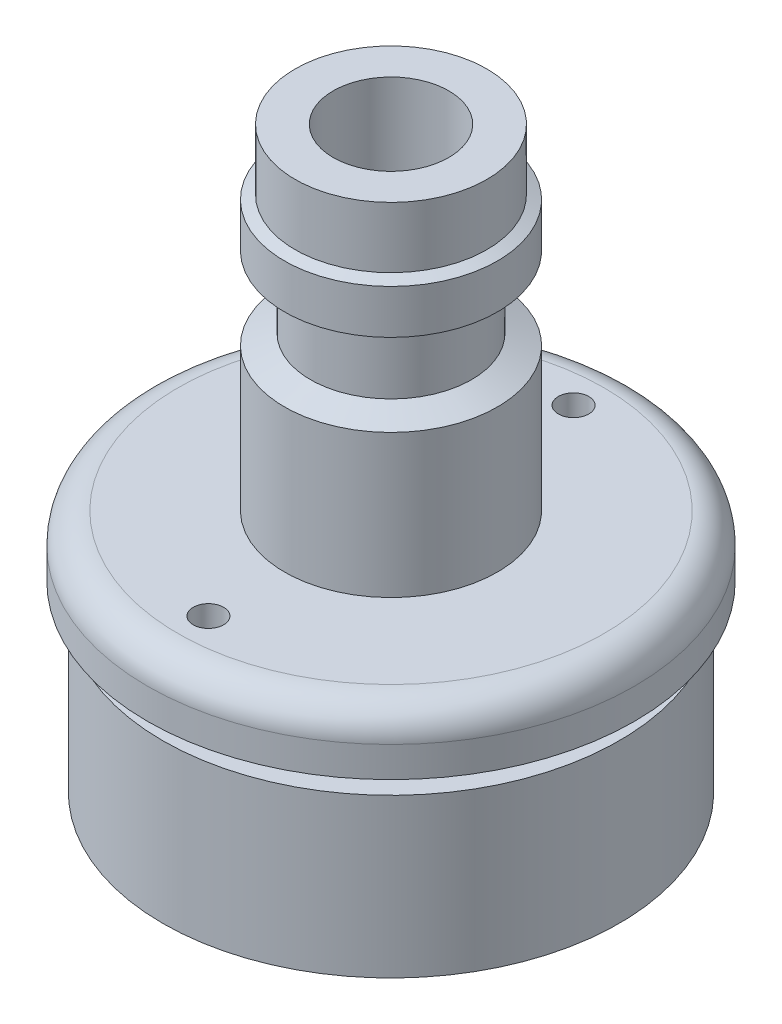
ISO-10303-21;
HEADER;
FILE_DESCRIPTION(('STEP AP214'),'2;1');
FILE_NAME('part.step','',(''),(''),'','','');
FILE_SCHEMA(('AUTOMOTIVE_DESIGN { 1 0 10303 214 1 1 1 1 }'));
ENDSEC;
DATA;
#1=APPLICATION_CONTEXT('core data for automotive mechanical design processes');
#2=APPLICATION_PROTOCOL_DEFINITION('international standard','automotive_design',2000,#1);
#3=PRODUCT_CONTEXT('',#1,'mechanical');
#4=PRODUCT('Part','Part','',(#3));
#5=PRODUCT_RELATED_PRODUCT_CATEGORY('part','',(#4));
#6=PRODUCT_DEFINITION_FORMATION('','',#4);
#7=PRODUCT_DEFINITION_CONTEXT('part definition',#1,'design');
#8=PRODUCT_DEFINITION('design','',#6,#7);
#9=PRODUCT_DEFINITION_SHAPE('','',#8);
#10=(LENGTH_UNIT() NAMED_UNIT(*) SI_UNIT(.MILLI.,.METRE.));
#11=(NAMED_UNIT(*) PLANE_ANGLE_UNIT() SI_UNIT($,.RADIAN.));
#12=(NAMED_UNIT(*) SI_UNIT($,.STERADIAN.) SOLID_ANGLE_UNIT());
#13=UNCERTAINTY_MEASURE_WITH_UNIT(LENGTH_MEASURE(1.E-05),#10,'distance_accuracy_value','');
#14=(GEOMETRIC_REPRESENTATION_CONTEXT(3) GLOBAL_UNCERTAINTY_ASSIGNED_CONTEXT((#13)) GLOBAL_UNIT_ASSIGNED_CONTEXT((#10,
#11,#12)) REPRESENTATION_CONTEXT('',''));
#15=CARTESIAN_POINT('',(0.,0.,0.));
#16=DIRECTION('',(0.,0.,1.));
#17=DIRECTION('',(1.,0.,0.));
#18=AXIS2_PLACEMENT_3D('',#15,#16,#17);
#19=CARTESIAN_POINT('',(8.89,2.54,0.));
#20=DIRECTION('',(0.,1.,0.));
#21=DIRECTION('',(0.,0.,1.));
#22=AXIS2_PLACEMENT_3D('',#19,#20,#21);
#23=PLANE('',#22);
#24=CARTESIAN_POINT('',(0.,2.54,0.));
#25=DIRECTION('',(0.,-1.,0.));
#26=DIRECTION('',(0.,0.,-1.));
#27=AXIS2_PLACEMENT_3D('',#24,#25,#26);
#28=CIRCLE('',#27,8.89);
#29=CARTESIAN_POINT('',(0.,2.54,-8.89));
#30=VERTEX_POINT('',#29);
#31=EDGE_CURVE('E65',#30,#30,#28,.T.);
#32=ORIENTED_EDGE('',*,*,#31,.F.);
#33=EDGE_LOOP('',(#32));
#34=FACE_BOUND('',#33,.T.);
#35=CARTESIAN_POINT('',(0.,2.54,0.));
#36=DIRECTION('',(0.,-1.,0.));
#37=DIRECTION('',(0.,0.,-1.));
#38=AXIS2_PLACEMENT_3D('',#35,#36,#37);
#39=CIRCLE('',#38,4.445);
#40=CARTESIAN_POINT('',(0.,2.54,-4.445));
#41=VERTEX_POINT('',#40);
#42=EDGE_CURVE('E69',#41,#41,#39,.T.);
#43=ORIENTED_EDGE('',*,*,#42,.T.);
#44=EDGE_LOOP('',(#43));
#45=FACE_BOUND('',#44,.T.);
#46=CARTESIAN_POINT('',(0.,2.54,-7.62));
#47=DIRECTION('',(0.,1.,0.));
#48=DIRECTION('',(0.,0.,1.));
#49=AXIS2_PLACEMENT_3D('',#46,#47,#48);
#50=CIRCLE('',#49,0.635);
#51=CARTESIAN_POINT('',(0.,2.54,-6.985));
#52=VERTEX_POINT('',#51);
#53=EDGE_CURVE('E103',#52,#52,#50,.T.);
#54=ORIENTED_EDGE('',*,*,#53,.F.);
#55=EDGE_LOOP('',(#54));
#56=FACE_BOUND('',#55,.T.);
#57=CARTESIAN_POINT('',(0.,2.54,7.62));
#58=DIRECTION('',(0.,-1.,0.));
#59=DIRECTION('',(0.,0.,-1.));
#60=AXIS2_PLACEMENT_3D('',#57,#58,#59);
#61=CIRCLE('',#60,0.635);
#62=CARTESIAN_POINT('',(0.,2.54,6.985));
#63=VERTEX_POINT('',#62);
#64=EDGE_CURVE('E109',#63,#63,#61,.T.);
#65=ORIENTED_EDGE('',*,*,#64,.T.);
#66=EDGE_LOOP('',(#65));
#67=FACE_BOUND('',#66,.T.);
#68=ADVANCED_FACE('F32',(#34,#45,#56,#67),#23,.T.);
#69=CARTESIAN_POINT('',(4.0005,16.51,0.));
#70=DIRECTION('',(0.,1.,0.));
#71=DIRECTION('',(0.,0.,1.));
#72=AXIS2_PLACEMENT_3D('',#69,#70,#71);
#73=PLANE('',#72);
#74=CARTESIAN_POINT('',(0.,16.51,0.));
#75=DIRECTION('',(0.,-1.,0.));
#76=DIRECTION('',(0.,0.,-1.));
#77=AXIS2_PLACEMENT_3D('',#74,#75,#76);
#78=CIRCLE('',#77,4.0005);
#79=CARTESIAN_POINT('',(0.,16.51,-4.0005));
#80=VERTEX_POINT('',#79);
#81=EDGE_CURVE('E90',#80,#80,#78,.T.);
#82=ORIENTED_EDGE('',*,*,#81,.F.);
#83=EDGE_LOOP('',(#82));
#84=FACE_BOUND('',#83,.T.);
#85=CARTESIAN_POINT('',(0.,16.51,0.));
#86=DIRECTION('',(0.,1.,0.));
#87=DIRECTION('',(0.,0.,1.));
#88=AXIS2_PLACEMENT_3D('',#85,#86,#87);
#89=CIRCLE('',#88,2.413);
#90=CARTESIAN_POINT('',(0.,16.51,2.413));
#91=VERTEX_POINT('',#90);
#92=EDGE_CURVE('E97',#91,#91,#89,.T.);
#93=ORIENTED_EDGE('',*,*,#92,.F.);
#94=EDGE_LOOP('',(#93));
#95=FACE_BOUND('',#94,.T.);
#96=ADVANCED_FACE('F127',(#84,#95),#73,.T.);
#97=CARTESIAN_POINT('',(0.,0.,0.));
#98=DIRECTION('',(0.,1.,0.));
#99=DIRECTION('',(0.,0.,1.));
#100=AXIS2_PLACEMENT_3D('',#97,#98,#99);
#101=PLANE('',#100);
#102=CARTESIAN_POINT('',(0.,0.,0.));
#103=DIRECTION('',(0.,1.,0.));
#104=DIRECTION('',(0.,0.,1.));
#105=AXIS2_PLACEMENT_3D('',#102,#103,#104);
#106=CIRCLE('',#105,4.19100000000003);
#107=CARTESIAN_POINT('',(0.,0.,4.19100000000003));
#108=VERTEX_POINT('',#107);
#109=EDGE_CURVE('E39',#108,#108,#106,.T.);
#110=ORIENTED_EDGE('',*,*,#109,.T.);
#111=EDGE_LOOP('',(#110));
#112=FACE_BOUND('',#111,.T.);
#113=CARTESIAN_POINT('',(0.,0.,0.));
#114=DIRECTION('',(0.,1.,0.));
#115=DIRECTION('',(0.,0.,1.));
#116=AXIS2_PLACEMENT_3D('',#113,#114,#115);
#117=CIRCLE('',#116,7.1374);
#118=CARTESIAN_POINT('',(0.,0.,7.1374));
#119=VERTEX_POINT('',#118);
#120=EDGE_CURVE('E94',#119,#119,#117,.T.);
#121=ORIENTED_EDGE('',*,*,#120,.F.);
#122=EDGE_LOOP('',(#121));
#123=FACE_BOUND('',#122,.T.);
#124=ADVANCED_FACE('F133',(#112,#123),#101,.F.);
#125=CARTESIAN_POINT('',(0.,-7.62,0.));
#126=DIRECTION('',(0.,1.,0.));
#127=DIRECTION('',(0.,0.,1.));
#128=AXIS2_PLACEMENT_3D('',#125,#126,#127);
#129=CYLINDRICAL_SURFACE('',#128,9.525);
#130=CARTESIAN_POINT('',(0.,-7.62,0.));
#131=DIRECTION('',(0.,1.,0.));
#132=DIRECTION('',(0.,0.,1.));
#133=AXIS2_PLACEMENT_3D('',#130,#131,#132);
#134=CIRCLE('',#133,9.525);
#135=CARTESIAN_POINT('',(0.,-7.62,9.525));
#136=VERTEX_POINT('',#135);
#137=EDGE_CURVE('E43',#136,#136,#134,.T.);
#138=CARTESIAN_POINT('',(0.,-1.016,0.));
#139=DIRECTION('',(0.,1.,0.));
#140=DIRECTION('',(0.,0.,1.));
#141=AXIS2_PLACEMENT_3D('',#138,#139,#140);
#142=CIRCLE('',#141,9.525);
#143=CARTESIAN_POINT('',(0.,-1.016,9.525));
#144=VERTEX_POINT('',#143);
#145=EDGE_CURVE('E48',#144,#144,#142,.F.);
#146=CARTESIAN_POINT('',(0.,-7.62,9.525));
#147=CARTESIAN_POINT('',(0.,-7.55120833333333,9.525));
#148=CARTESIAN_POINT('',(0.,-7.48241666666667,9.525));
#149=CARTESIAN_POINT('',(0.,-7.34483333333333,9.525));
#150=CARTESIAN_POINT('',(0.,-7.27604166666667,9.525));
#151=CARTESIAN_POINT('',(0.,-7.13845833333333,9.525));
#152=CARTESIAN_POINT('',(0.,-7.06966666666667,9.525));
#153=CARTESIAN_POINT('',(0.,-6.93208333333333,9.525));
#154=CARTESIAN_POINT('',(0.,-6.86329166666667,9.525));
#155=CARTESIAN_POINT('',(0.,-6.72570833333333,9.525));
#156=CARTESIAN_POINT('',(0.,-6.65691666666667,9.525));
#157=CARTESIAN_POINT('',(0.,-6.51933333333333,9.525));
#158=CARTESIAN_POINT('',(0.,-6.45054166666667,9.525));
#159=CARTESIAN_POINT('',(0.,-6.31295833333333,9.525));
#160=CARTESIAN_POINT('',(0.,-6.24416666666667,9.525));
#161=CARTESIAN_POINT('',(0.,-6.10658333333333,9.525));
#162=CARTESIAN_POINT('',(0.,-6.03779166666667,9.525));
#163=CARTESIAN_POINT('',(0.,-5.90020833333333,9.525));
#164=CARTESIAN_POINT('',(0.,-5.83141666666667,9.525));
#165=CARTESIAN_POINT('',(0.,-5.69383333333333,9.525));
#166=CARTESIAN_POINT('',(0.,-5.62504166666667,9.525));
#167=CARTESIAN_POINT('',(0.,-5.48745833333333,9.525));
#168=CARTESIAN_POINT('',(0.,-5.41866666666667,9.525));
#169=CARTESIAN_POINT('',(0.,-5.28108333333333,9.525));
#170=CARTESIAN_POINT('',(0.,-5.21229166666667,9.525));
#171=CARTESIAN_POINT('',(0.,-5.07470833333333,9.525));
#172=CARTESIAN_POINT('',(0.,-5.00591666666667,9.525));
#173=CARTESIAN_POINT('',(0.,-4.86833333333333,9.525));
#174=CARTESIAN_POINT('',(0.,-4.79954166666667,9.525));
#175=CARTESIAN_POINT('',(0.,-4.66195833333333,9.525));
#176=CARTESIAN_POINT('',(0.,-4.59316666666667,9.525));
#177=CARTESIAN_POINT('',(0.,-4.45558333333333,9.525));
#178=CARTESIAN_POINT('',(0.,-4.38679166666667,9.525));
#179=CARTESIAN_POINT('',(0.,-4.24920833333333,9.525));
#180=CARTESIAN_POINT('',(0.,-4.18041666666667,9.525));
#181=CARTESIAN_POINT('',(0.,-4.04283333333333,9.525));
#182=CARTESIAN_POINT('',(0.,-3.97404166666667,9.525));
#183=CARTESIAN_POINT('',(0.,-3.83645833333333,9.525));
#184=CARTESIAN_POINT('',(0.,-3.76766666666667,9.525));
#185=CARTESIAN_POINT('',(0.,-3.63008333333333,9.525));
#186=CARTESIAN_POINT('',(0.,-3.56129166666667,9.525));
#187=CARTESIAN_POINT('',(0.,-3.42370833333333,9.525));
#188=CARTESIAN_POINT('',(0.,-3.35491666666667,9.525));
#189=CARTESIAN_POINT('',(0.,-3.21733333333333,9.525));
#190=CARTESIAN_POINT('',(0.,-3.14854166666667,9.525));
#191=CARTESIAN_POINT('',(0.,-3.01095833333333,9.525));
#192=CARTESIAN_POINT('',(0.,-2.94216666666667,9.525));
#193=CARTESIAN_POINT('',(0.,-2.80458333333333,9.525));
#194=CARTESIAN_POINT('',(0.,-2.73579166666667,9.525));
#195=CARTESIAN_POINT('',(0.,-2.59820833333333,9.525));
#196=CARTESIAN_POINT('',(0.,-2.52941666666667,9.525));
#197=CARTESIAN_POINT('',(0.,-2.39183333333333,9.525));
#198=CARTESIAN_POINT('',(0.,-2.32304166666667,9.525));
#199=CARTESIAN_POINT('',(0.,-2.18545833333333,9.525));
#200=CARTESIAN_POINT('',(0.,-2.11666666666667,9.525));
#201=CARTESIAN_POINT('',(0.,-1.97908333333333,9.525));
#202=CARTESIAN_POINT('',(0.,-1.91029166666667,9.525));
#203=CARTESIAN_POINT('',(0.,-1.77270833333333,9.525));
#204=CARTESIAN_POINT('',(0.,-1.70391666666667,9.525));
#205=CARTESIAN_POINT('',(0.,-1.56633333333333,9.525));
#206=CARTESIAN_POINT('',(0.,-1.49754166666667,9.525));
#207=CARTESIAN_POINT('',(0.,-1.35995833333333,9.525));
#208=CARTESIAN_POINT('',(0.,-1.29116666666667,9.525));
#209=CARTESIAN_POINT('',(0.,-1.15358333333333,9.525));
#210=CARTESIAN_POINT('',(0.,-1.08479166666667,9.525));
#211=CARTESIAN_POINT('',(0.,-1.016,9.525));
#212=B_SPLINE_CURVE_WITH_KNOTS('',3,(#146,#147,#148,#149,#150,#151,#152,#153,#154,#155,#156,
#157,#158,#159,#160,#161,#162,#163,#164,#165,#166,#167,#168,#169,#170,#171,#172,#173,#174,#175,
#176,#177,#178,#179,#180,#181,#182,#183,#184,#185,#186,#187,#188,#189,#190,#191,#192,#193,#194,
#195,#196,#197,#198,#199,#200,#201,#202,#203,#204,#205,#206,#207,#208,#209,#210,#211),
.UNSPECIFIED.,.F.,.F.,(4,2,2,2,2,2,2,2,2,2,2,2,2,2,2,2,2,2,2,2,2,2,2,2,2,2,2,2,2,2,2,2,4),(0.,
0.206374999999999,0.412749999999999,0.619124999999999,0.825499999999999,1.031875,1.23825,
1.444625,1.651,1.857375,2.06375,2.270125,2.4765,2.682875,2.88925,3.095625,3.302,3.508375,
3.71475,3.921125,4.1275,4.333875,4.54025,4.746625,4.953,5.159375,5.36575,5.572125,5.7785,
5.984875,6.19125,6.397625,6.604),.UNSPECIFIED.);
#213=EDGE_CURVE('BSEAM164',#136,#144,#212,.T.);
#214=ORIENTED_EDGE('',*,*,#137,.T.);
#215=ORIENTED_EDGE('',*,*,#145,.T.);
#216=ORIENTED_EDGE('',*,*,#213,.T.);
#217=ORIENTED_EDGE('',*,*,#213,.F.);
#218=EDGE_LOOP('',(#214,#216,#215,#217));
#219=FACE_BOUND('',#218,.T.);
#220=ADVANCED_FACE('F164',(#219),#129,.T.);
#221=CARTESIAN_POINT('',(0.,-7.62,0.));
#222=DIRECTION('',(0.,1.,0.));
#223=DIRECTION('',(0.,0.,1.));
#224=AXIS2_PLACEMENT_3D('',#221,#222,#223);
#225=PLANE('',#224);
#226=CARTESIAN_POINT('',(0.,-7.62,0.));
#227=DIRECTION('',(0.,1.,0.));
#228=DIRECTION('',(0.,0.,1.));
#229=AXIS2_PLACEMENT_3D('',#226,#227,#228);
#230=CIRCLE('',#229,7.1374);
#231=CARTESIAN_POINT('',(0.,-7.62,7.1374));
#232=VERTEX_POINT('',#231);
#233=EDGE_CURVE('E93',#232,#232,#230,.T.);
#234=ORIENTED_EDGE('',*,*,#233,.T.);
#235=EDGE_LOOP('',(#234));
#236=FACE_BOUND('',#235,.T.);
#237=ORIENTED_EDGE('',*,*,#137,.F.);
#238=EDGE_LOOP('',(#237));
#239=FACE_BOUND('',#238,.T.);
#240=ADVANCED_FACE('F161',(#236,#239),#225,.F.);
#241=CARTESIAN_POINT('',(0.,-1.016,0.));
#242=DIRECTION('',(0.,1.,0.));
#243=DIRECTION('',(0.,0.,1.));
#244=AXIS2_PLACEMENT_3D('',#241,#242,#243);
#245=PLANE('',#244);
#246=ORIENTED_EDGE('',*,*,#145,.F.);
#247=EDGE_LOOP('',(#246));
#248=FACE_BOUND('',#247,.T.);
#249=CARTESIAN_POINT('',(0.,-1.016,0.));
#250=DIRECTION('',(0.,1.,0.));
#251=DIRECTION('',(0.,0.,1.));
#252=AXIS2_PLACEMENT_3D('',#249,#250,#251);
#253=CIRCLE('',#252,8.509);
#254=CARTESIAN_POINT('',(0.,-1.016,8.509));
#255=VERTEX_POINT('',#254);
#256=EDGE_CURVE('E52',#255,#255,#253,.T.);
#257=ORIENTED_EDGE('',*,*,#256,.F.);
#258=EDGE_LOOP('',(#257));
#259=FACE_BOUND('',#258,.T.);
#260=ADVANCED_FACE('F157',(#248,#259),#245,.T.);
#261=CARTESIAN_POINT('',(0.,-1.016,0.));
#262=DIRECTION('',(0.,1.,0.));
#263=DIRECTION('',(0.,0.,1.));
#264=AXIS2_PLACEMENT_3D('',#261,#262,#263);
#265=CYLINDRICAL_SURFACE('',#264,8.509);
#266=ORIENTED_EDGE('',*,*,#256,.T.);
#267=EDGE_LOOP('',(#266));
#268=FACE_BOUND('',#267,.T.);
#269=CARTESIAN_POINT('',(0.,0.,0.));
#270=DIRECTION('',(0.,1.,0.));
#271=DIRECTION('',(0.,0.,1.));
#272=AXIS2_PLACEMENT_3D('',#269,#270,#271);
#273=CIRCLE('',#272,8.509);
#274=CARTESIAN_POINT('',(0.,0.,8.509));
#275=VERTEX_POINT('',#274);
#276=EDGE_CURVE('E54',#275,#275,#273,.T.);
#277=ORIENTED_EDGE('',*,*,#276,.F.);
#278=EDGE_LOOP('',(#277));
#279=FACE_BOUND('',#278,.T.);
#280=ADVANCED_FACE('F153',(#268,#279),#265,.T.);
#281=CARTESIAN_POINT('',(0.,0.,0.));
#282=DIRECTION('',(0.,-1.,0.));
#283=DIRECTION('',(0.,0.,-1.));
#284=AXIS2_PLACEMENT_3D('',#281,#282,#283);
#285=PLANE('',#284);
#286=ORIENTED_EDGE('',*,*,#276,.T.);
#287=EDGE_LOOP('',(#286));
#288=FACE_BOUND('',#287,.T.);
#289=CARTESIAN_POINT('',(0.,0.,0.));
#290=DIRECTION('',(0.,-1.,0.));
#291=DIRECTION('',(0.,0.,-1.));
#292=AXIS2_PLACEMENT_3D('',#289,#290,#291);
#293=CIRCLE('',#292,10.16);
#294=CARTESIAN_POINT('',(0.,0.,-10.16));
#295=VERTEX_POINT('',#294);
#296=EDGE_CURVE('E57',#295,#295,#293,.T.);
#297=ORIENTED_EDGE('',*,*,#296,.T.);
#298=EDGE_LOOP('',(#297));
#299=FACE_BOUND('',#298,.T.);
#300=ADVANCED_FACE('F149',(#288,#299),#285,.T.);
#301=CARTESIAN_POINT('',(0.,0.,0.));
#302=DIRECTION('',(0.,-1.,0.));
#303=DIRECTION('',(0.,0.,-1.));
#304=AXIS2_PLACEMENT_3D('',#301,#302,#303);
#305=CYLINDRICAL_SURFACE('',#304,10.16);
#306=CARTESIAN_POINT('',(0.,1.27,0.));
#307=DIRECTION('',(0.,-1.,0.));
#308=DIRECTION('',(0.,0.,-1.));
#309=AXIS2_PLACEMENT_3D('',#306,#307,#308);
#310=CIRCLE('',#309,10.16);
#311=CARTESIAN_POINT('',(0.,1.27,-10.16));
#312=VERTEX_POINT('',#311);
#313=EDGE_CURVE('E62',#312,#312,#310,.T.);
#314=ORIENTED_EDGE('',*,*,#313,.T.);
#315=EDGE_LOOP('',(#314));
#316=FACE_BOUND('',#315,.T.);
#317=ORIENTED_EDGE('',*,*,#296,.F.);
#318=EDGE_LOOP('',(#317));
#319=FACE_BOUND('',#318,.T.);
#320=ADVANCED_FACE('F145',(#316,#319),#305,.T.);
#321=CARTESIAN_POINT('',(0.,1.27,0.));
#322=DIRECTION('',(0.,-1.,0.));
#323=DIRECTION('',(0.,0.,-1.));
#324=AXIS2_PLACEMENT_3D('',#321,#322,#323);
#325=TOROIDAL_SURFACE('',#324,8.89,1.27);
#326=ORIENTED_EDGE('',*,*,#31,.T.);
#327=EDGE_LOOP('',(#326));
#328=FACE_BOUND('',#327,.T.);
#329=ORIENTED_EDGE('',*,*,#313,.F.);
#330=EDGE_LOOP('',(#329));
#331=FACE_BOUND('',#330,.T.);
#332=ADVANCED_FACE('F142',(#328,#331),#325,.T.);
#333=CARTESIAN_POINT('',(0.,0.,0.));
#334=DIRECTION('',(0.,-1.,0.));
#335=DIRECTION('',(0.,0.,-1.));
#336=AXIS2_PLACEMENT_3D('',#333,#334,#335);
#337=CYLINDRICAL_SURFACE('',#336,4.445);
#338=CARTESIAN_POINT('',(0.,8.509,0.));
#339=DIRECTION('',(0.,-1.,0.));
#340=DIRECTION('',(0.,0.,-1.));
#341=AXIS2_PLACEMENT_3D('',#338,#339,#340);
#342=CIRCLE('',#341,4.445);
#343=CARTESIAN_POINT('',(0.,8.509,-4.445));
#344=VERTEX_POINT('',#343);
#345=EDGE_CURVE('E72',#344,#344,#342,.T.);
#346=ORIENTED_EDGE('',*,*,#345,.T.);
#347=EDGE_LOOP('',(#346));
#348=FACE_BOUND('',#347,.T.);
#349=ORIENTED_EDGE('',*,*,#42,.F.);
#350=EDGE_LOOP('',(#349));
#351=FACE_BOUND('',#350,.T.);
#352=ADVANCED_FACE('F140',(#348,#351),#337,.T.);
#353=CARTESIAN_POINT('',(0.,8.95614354058175,0.));
#354=DIRECTION('',(0.,-1.,0.));
#355=DIRECTION('',(0.,0.,-1.));
#356=AXIS2_PLACEMENT_3D('',#353,#354,#355);
#357=CONICAL_SURFACE('',#356,3.3655,1.17809724509617);
#358=ORIENTED_EDGE('',*,*,#345,.F.);
#359=EDGE_LOOP('',(#358));
#360=FACE_BOUND('',#359,.T.);
#361=CARTESIAN_POINT('',(0.,8.95614354058175,0.));
#362=DIRECTION('',(0.,-1.,0.));
#363=DIRECTION('',(0.,0.,-1.));
#364=AXIS2_PLACEMENT_3D('',#361,#362,#363);
#365=CIRCLE('',#364,3.3655);
#366=CARTESIAN_POINT('',(0.,8.95614354058175,-3.3655));
#367=VERTEX_POINT('',#366);
#368=EDGE_CURVE('E75',#367,#367,#365,.T.);
#369=ORIENTED_EDGE('',*,*,#368,.T.);
#370=EDGE_LOOP('',(#369));
#371=FACE_BOUND('',#370,.T.);
#372=ADVANCED_FACE('F212',(#360,#371),#357,.T.);
#373=CARTESIAN_POINT('',(0.,0.,0.));
#374=DIRECTION('',(0.,-1.,0.));
#375=DIRECTION('',(0.,0.,-1.));
#376=AXIS2_PLACEMENT_3D('',#373,#374,#375);
#377=CYLINDRICAL_SURFACE('',#376,3.3655);
#378=ORIENTED_EDGE('',*,*,#368,.F.);
#379=EDGE_LOOP('',(#378));
#380=FACE_BOUND('',#379,.T.);
#381=CARTESIAN_POINT('',(0.,11.4961435405818,0.));
#382=DIRECTION('',(0.,-1.,0.));
#383=DIRECTION('',(0.,0.,-1.));
#384=AXIS2_PLACEMENT_3D('',#381,#382,#383);
#385=CIRCLE('',#384,3.3655);
#386=CARTESIAN_POINT('',(0.,11.4961435405818,-3.3655));
#387=VERTEX_POINT('',#386);
#388=EDGE_CURVE('E78',#387,#387,#385,.T.);
#389=ORIENTED_EDGE('',*,*,#388,.T.);
#390=EDGE_LOOP('',(#389));
#391=FACE_BOUND('',#390,.T.);
#392=ADVANCED_FACE('F209',(#380,#391),#377,.T.);
#393=CARTESIAN_POINT('',(0.,11.9432870811635,0.));
#394=DIRECTION('',(0.,1.,0.));
#395=DIRECTION('',(0.,0.,1.));
#396=AXIS2_PLACEMENT_3D('',#393,#394,#395);
#397=CONICAL_SURFACE('',#396,4.445,1.17809724509617);
#398=ORIENTED_EDGE('',*,*,#388,.F.);
#399=EDGE_LOOP('',(#398));
#400=FACE_BOUND('',#399,.T.);
#401=CARTESIAN_POINT('',(0.,11.9432870811635,0.));
#402=DIRECTION('',(0.,-1.,0.));
#403=DIRECTION('',(0.,0.,-1.));
#404=AXIS2_PLACEMENT_3D('',#401,#402,#403);
#405=CIRCLE('',#404,4.445);
#406=CARTESIAN_POINT('',(0.,11.9432870811635,-4.445));
#407=VERTEX_POINT('',#406);
#408=EDGE_CURVE('E81',#407,#407,#405,.T.);
#409=ORIENTED_EDGE('',*,*,#408,.T.);
#410=EDGE_LOOP('',(#409));
#411=FACE_BOUND('',#410,.T.);
#412=ADVANCED_FACE('F205',(#400,#411),#397,.T.);
#413=CARTESIAN_POINT('',(0.,0.,0.));
#414=DIRECTION('',(0.,-1.,0.));
#415=DIRECTION('',(0.,0.,-1.));
#416=AXIS2_PLACEMENT_3D('',#413,#414,#415);
#417=CYLINDRICAL_SURFACE('',#416,4.445);
#418=CARTESIAN_POINT('',(0.,13.7858820715252,0.));
#419=DIRECTION('',(0.,-1.,0.));
#420=DIRECTION('',(0.,0.,-1.));
#421=AXIS2_PLACEMENT_3D('',#418,#419,#420);
#422=CIRCLE('',#421,4.445);
#423=CARTESIAN_POINT('',(0.,13.7858820715252,-4.445));
#424=VERTEX_POINT('',#423);
#425=EDGE_CURVE('E84',#424,#424,#422,.T.);
#426=ORIENTED_EDGE('',*,*,#425,.T.);
#427=EDGE_LOOP('',(#426));
#428=FACE_BOUND('',#427,.T.);
#429=ORIENTED_EDGE('',*,*,#408,.F.);
#430=EDGE_LOOP('',(#429));
#431=FACE_BOUND('',#430,.T.);
#432=ADVANCED_FACE('F201',(#428,#431),#417,.T.);
#433=CARTESIAN_POINT('',(0.,13.7858820715252,0.));
#434=DIRECTION('',(0.,-1.,0.));
#435=DIRECTION('',(0.,0.,-1.));
#436=AXIS2_PLACEMENT_3D('',#433,#434,#435);
#437=CONICAL_SURFACE('',#436,4.445,1.17809724509618);
#438=CARTESIAN_POINT('',(0.,13.97,0.));
#439=DIRECTION('',(0.,-1.,0.));
#440=DIRECTION('',(0.,0.,-1.));
#441=AXIS2_PLACEMENT_3D('',#438,#439,#440);
#442=CIRCLE('',#441,4.0005);
#443=CARTESIAN_POINT('',(0.,13.97,-4.0005));
#444=VERTEX_POINT('',#443);
#445=EDGE_CURVE('E87',#444,#444,#442,.T.);
#446=ORIENTED_EDGE('',*,*,#445,.T.);
#447=EDGE_LOOP('',(#446));
#448=FACE_BOUND('',#447,.T.);
#449=ORIENTED_EDGE('',*,*,#425,.F.);
#450=EDGE_LOOP('',(#449));
#451=FACE_BOUND('',#450,.T.);
#452=ADVANCED_FACE('F197',(#448,#451),#437,.T.);
#453=CARTESIAN_POINT('',(0.,0.,0.));
#454=DIRECTION('',(0.,-1.,0.));
#455=DIRECTION('',(0.,0.,-1.));
#456=AXIS2_PLACEMENT_3D('',#453,#454,#455);
#457=CYLINDRICAL_SURFACE('',#456,4.0005);
#458=ORIENTED_EDGE('',*,*,#81,.T.);
#459=EDGE_LOOP('',(#458));
#460=FACE_BOUND('',#459,.T.);
#461=ORIENTED_EDGE('',*,*,#445,.F.);
#462=EDGE_LOOP('',(#461));
#463=FACE_BOUND('',#462,.T.);
#464=ADVANCED_FACE('F192',(#460,#463),#457,.T.);
#465=CARTESIAN_POINT('',(0.,-7.62,0.));
#466=DIRECTION('',(0.,1.,0.));
#467=DIRECTION('',(0.,0.,1.));
#468=AXIS2_PLACEMENT_3D('',#465,#466,#467);
#469=CYLINDRICAL_SURFACE('',#468,7.1374);
#470=CARTESIAN_POINT('',(0.,-7.62,7.1374));
#471=CARTESIAN_POINT('',(0.,-7.540625,7.1374));
#472=CARTESIAN_POINT('',(0.,-7.46125,7.1374));
#473=CARTESIAN_POINT('',(0.,-7.3025,7.1374));
#474=CARTESIAN_POINT('',(0.,-7.223125,7.1374));
#475=CARTESIAN_POINT('',(0.,-7.064375,7.1374));
#476=CARTESIAN_POINT('',(0.,-6.985,7.1374));
#477=CARTESIAN_POINT('',(0.,-6.82625,7.1374));
#478=CARTESIAN_POINT('',(0.,-6.746875,7.1374));
#479=CARTESIAN_POINT('',(0.,-6.588125,7.1374));
#480=CARTESIAN_POINT('',(0.,-6.50875,7.1374));
#481=CARTESIAN_POINT('',(0.,-6.35,7.1374));
#482=CARTESIAN_POINT('',(0.,-6.270625,7.1374));
#483=CARTESIAN_POINT('',(0.,-6.111875,7.1374));
#484=CARTESIAN_POINT('',(0.,-6.0325,7.1374));
#485=CARTESIAN_POINT('',(0.,-5.87375,7.1374));
#486=CARTESIAN_POINT('',(0.,-5.794375,7.1374));
#487=CARTESIAN_POINT('',(0.,-5.635625,7.1374));
#488=CARTESIAN_POINT('',(0.,-5.55625,7.1374));
#489=CARTESIAN_POINT('',(0.,-5.3975,7.1374));
#490=CARTESIAN_POINT('',(0.,-5.318125,7.1374));
#491=CARTESIAN_POINT('',(0.,-5.159375,7.1374));
#492=CARTESIAN_POINT('',(0.,-5.08,7.1374));
#493=CARTESIAN_POINT('',(0.,-4.92125,7.1374));
#494=CARTESIAN_POINT('',(0.,-4.841875,7.1374));
#495=CARTESIAN_POINT('',(0.,-4.683125,7.1374));
#496=CARTESIAN_POINT('',(0.,-4.60375,7.1374));
#497=CARTESIAN_POINT('',(0.,-4.445,7.1374));
#498=CARTESIAN_POINT('',(0.,-4.365625,7.1374));
#499=CARTESIAN_POINT('',(0.,-4.206875,7.1374));
#500=CARTESIAN_POINT('',(0.,-4.1275,7.1374));
#501=CARTESIAN_POINT('',(0.,-3.96875,7.1374));
#502=CARTESIAN_POINT('',(0.,-3.889375,7.1374));
#503=CARTESIAN_POINT('',(0.,-3.730625,7.1374));
#504=CARTESIAN_POINT('',(0.,-3.65125,7.1374));
#505=CARTESIAN_POINT('',(0.,-3.4925,7.1374));
#506=CARTESIAN_POINT('',(0.,-3.413125,7.1374));
#507=CARTESIAN_POINT('',(0.,-3.254375,7.1374));
#508=CARTESIAN_POINT('',(0.,-3.175,7.1374));
#509=CARTESIAN_POINT('',(0.,-3.01625,7.1374));
#510=CARTESIAN_POINT('',(0.,-2.936875,7.1374));
#511=CARTESIAN_POINT('',(0.,-2.778125,7.1374));
#512=CARTESIAN_POINT('',(0.,-2.69875,7.1374));
#513=CARTESIAN_POINT('',(0.,-2.54,7.1374));
#514=CARTESIAN_POINT('',(0.,-2.460625,7.1374));
#515=CARTESIAN_POINT('',(0.,-2.301875,7.1374));
#516=CARTESIAN_POINT('',(0.,-2.2225,7.1374));
#517=CARTESIAN_POINT('',(0.,-2.06375,7.1374));
#518=CARTESIAN_POINT('',(0.,-1.984375,7.1374));
#519=CARTESIAN_POINT('',(0.,-1.825625,7.1374));
#520=CARTESIAN_POINT('',(0.,-1.74625,7.1374));
#521=CARTESIAN_POINT('',(0.,-1.5875,7.1374));
#522=CARTESIAN_POINT('',(0.,-1.508125,7.1374));
#523=CARTESIAN_POINT('',(0.,-1.349375,7.1374));
#524=CARTESIAN_POINT('',(0.,-1.27,7.1374));
#525=CARTESIAN_POINT('',(0.,-1.11125,7.1374));
#526=CARTESIAN_POINT('',(0.,-1.031875,7.1374));
#527=CARTESIAN_POINT('',(0.,-0.873125,7.1374));
#528=CARTESIAN_POINT('',(0.,-0.79375,7.1374));
#529=CARTESIAN_POINT('',(0.,-0.635,7.1374));
#530=CARTESIAN_POINT('',(0.,-0.555625,7.1374));
#531=CARTESIAN_POINT('',(0.,-0.396875,7.1374));
#532=CARTESIAN_POINT('',(0.,-0.3175,7.1374));
#533=CARTESIAN_POINT('',(0.,-0.15875,7.1374));
#534=CARTESIAN_POINT('',(0.,-0.0793749999999999,7.1374));
#535=CARTESIAN_POINT('',(0.,0.,7.1374));
#536=B_SPLINE_CURVE_WITH_KNOTS('',3,(#470,#471,#472,#473,#474,#475,#476,#477,#478,#479,#480,
#481,#482,#483,#484,#485,#486,#487,#488,#489,#490,#491,#492,#493,#494,#495,#496,#497,#498,#499,
#500,#501,#502,#503,#504,#505,#506,#507,#508,#509,#510,#511,#512,#513,#514,#515,#516,#517,#518,
#519,#520,#521,#522,#523,#524,#525,#526,#527,#528,#529,#530,#531,#532,#533,#534,#535),
.UNSPECIFIED.,.F.,.F.,(4,2,2,2,2,2,2,2,2,2,2,2,2,2,2,2,2,2,2,2,2,2,2,2,2,2,2,2,2,2,2,2,4),(0.,
0.238125,0.47625,0.714375000000001,0.9525,1.190625,1.42875,1.666875,1.905,2.143125,2.38125,
2.619375,2.8575,3.095625,3.33375,3.571875,3.81,4.048125,4.28625,4.524375,4.7625,5.000625,
5.23875,5.476875,5.715,5.953125,6.19125,6.429375,6.6675,6.905625,7.14375,7.381875,7.62),.UNSPECIFIED.);
#537=EDGE_CURVE('BSEAM190',#232,#119,#536,.T.);
#538=ORIENTED_EDGE('',*,*,#233,.F.);
#539=ORIENTED_EDGE('',*,*,#120,.T.);
#540=ORIENTED_EDGE('',*,*,#537,.T.);
#541=ORIENTED_EDGE('',*,*,#537,.F.);
#542=EDGE_LOOP('',(#538,#540,#539,#541));
#543=FACE_BOUND('',#542,.T.);
#544=ADVANCED_FACE('F190',(#543),#469,.F.);
#545=CARTESIAN_POINT('',(0.,16.51,0.));
#546=DIRECTION('',(0.,-1.,0.));
#547=DIRECTION('',(0.,0.,-1.));
#548=AXIS2_PLACEMENT_3D('',#545,#546,#547);
#549=CYLINDRICAL_SURFACE('',#548,2.413);
#550=CARTESIAN_POINT('',(0.,1.77800000000001,0.));
#551=DIRECTION('',(0.,1.,0.));
#552=DIRECTION('',(0.,0.,1.));
#553=AXIS2_PLACEMENT_3D('',#550,#551,#552);
#554=CIRCLE('',#553,2.413);
#555=CARTESIAN_POINT('',(0.,1.77800000000001,2.413));
#556=VERTEX_POINT('',#555);
#557=EDGE_CURVE('E10',#556,#556,#554,.F.);
#558=ORIENTED_EDGE('',*,*,#557,.T.);
#559=EDGE_LOOP('',(#558));
#560=FACE_BOUND('',#559,.T.);
#561=ORIENTED_EDGE('',*,*,#92,.T.);
#562=EDGE_LOOP('',(#561));
#563=FACE_BOUND('',#562,.T.);
#564=ADVANCED_FACE('F188',(#560,#563),#549,.F.);
#565=CARTESIAN_POINT('',(0.,0.,0.));
#566=DIRECTION('',(0.,-1.,0.));
#567=DIRECTION('',(0.,0.,-1.));
#568=AXIS2_PLACEMENT_3D('',#565,#566,#567);
#569=CONICAL_SURFACE('',#568,4.19100000000003,0.785398163397454);
#570=ORIENTED_EDGE('',*,*,#557,.F.);
#571=EDGE_LOOP('',(#570));
#572=FACE_BOUND('',#571,.T.);
#573=ORIENTED_EDGE('',*,*,#109,.F.);
#574=EDGE_LOOP('',(#573));
#575=FACE_BOUND('',#574,.T.);
#576=ADVANCED_FACE('F34',(#572,#575),#569,.F.);
#577=CARTESIAN_POINT('',(0.,1.016,-7.62));
#578=DIRECTION('',(0.,1.,0.));
#579=DIRECTION('',(0.,0.,1.));
#580=AXIS2_PLACEMENT_3D('',#577,#578,#579);
#581=CYLINDRICAL_SURFACE('',#580,0.635);
#582=CARTESIAN_POINT('',(0.,1.016,-7.62));
#583=DIRECTION('',(0.,1.,0.));
#584=DIRECTION('',(0.,0.,1.));
#585=AXIS2_PLACEMENT_3D('',#582,#583,#584);
#586=CIRCLE('',#585,0.635);
#587=CARTESIAN_POINT('',(0.,1.016,-6.985));
#588=VERTEX_POINT('',#587);
#589=EDGE_CURVE('E102',#588,#588,#586,.T.);
#590=ORIENTED_EDGE('',*,*,#589,.F.);
#591=EDGE_LOOP('',(#590));
#592=FACE_BOUND('',#591,.T.);
#593=ORIENTED_EDGE('',*,*,#53,.T.);
#594=EDGE_LOOP('',(#593));
#595=FACE_BOUND('',#594,.T.);
#596=ADVANCED_FACE('F235',(#592,#595),#581,.F.);
#597=CARTESIAN_POINT('',(0.,1.016,-7.62));
#598=DIRECTION('',(0.,1.,0.));
#599=DIRECTION('',(0.,0.,1.));
#600=AXIS2_PLACEMENT_3D('',#597,#598,#599);
#601=PLANE('',#600);
#602=ORIENTED_EDGE('',*,*,#589,.T.);
#603=EDGE_LOOP('',(#602));
#604=FACE_BOUND('',#603,.T.);
#605=ADVANCED_FACE('F124',(#604),#601,.T.);
#606=CARTESIAN_POINT('',(0.,1.016,7.62));
#607=DIRECTION('',(0.,1.,0.));
#608=DIRECTION('',(0.,0.,1.));
#609=AXIS2_PLACEMENT_3D('',#606,#607,#608);
#610=CYLINDRICAL_SURFACE('',#609,0.635);
#611=CARTESIAN_POINT('',(0.,1.016,7.62));
#612=DIRECTION('',(0.,-1.,0.));
#613=DIRECTION('',(0.,0.,-1.));
#614=AXIS2_PLACEMENT_3D('',#611,#612,#613);
#615=CIRCLE('',#614,0.635);
#616=CARTESIAN_POINT('',(0.,1.016,6.985));
#617=VERTEX_POINT('',#616);
#618=EDGE_CURVE('E106',#617,#617,#615,.T.);
#619=ORIENTED_EDGE('',*,*,#618,.T.);
#620=EDGE_LOOP('',(#619));
#621=FACE_BOUND('',#620,.T.);
#622=ORIENTED_EDGE('',*,*,#64,.F.);
#623=EDGE_LOOP('',(#622));
#624=FACE_BOUND('',#623,.T.);
#625=ADVANCED_FACE('F115',(#621,#624),#610,.F.);
#626=CARTESIAN_POINT('',(0.,1.016,7.62));
#627=DIRECTION('',(0.,-1.,0.));
#628=DIRECTION('',(0.,0.,-1.));
#629=AXIS2_PLACEMENT_3D('',#626,#627,#628);
#630=PLANE('',#629);
#631=ORIENTED_EDGE('',*,*,#618,.F.);
#632=EDGE_LOOP('',(#631));
#633=FACE_BOUND('',#632,.T.);
#634=ADVANCED_FACE('F118',(#633),#630,.F.);
#635=CLOSED_SHELL('',(#68,#96,#124,#220,#240,#260,#280,#300,#320,#332,#352,#372,#392,#412,#432,
#452,#464,#544,#564,#576,#596,#605,#625,#634));
#636=MANIFOLD_SOLID_BREP('B2',#635);
#637=ADVANCED_BREP_SHAPE_REPRESENTATION('',(#18,#636),#14);
#638=SHAPE_DEFINITION_REPRESENTATION(#9,#637);
ENDSEC;
END-ISO-10303-21;
